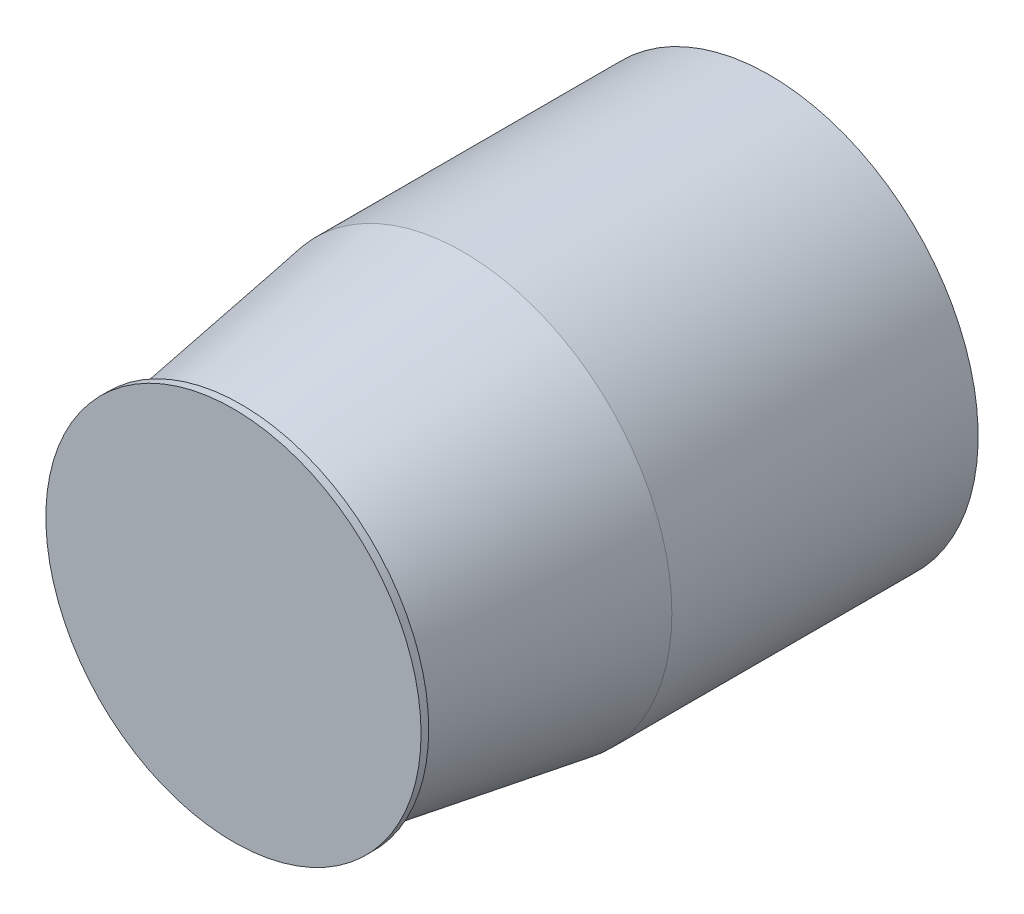
ISO-10303-21;
HEADER;
FILE_DESCRIPTION(('STEP AP214'),'2;1');
FILE_NAME('part.step','',(''),(''),'','','');
FILE_SCHEMA(('AUTOMOTIVE_DESIGN { 1 0 10303 214 1 1 1 1 }'));
ENDSEC;
DATA;
#1=APPLICATION_CONTEXT('core data for automotive mechanical design processes');
#2=APPLICATION_PROTOCOL_DEFINITION('international standard','automotive_design',2000,#1);
#3=PRODUCT_CONTEXT('',#1,'mechanical');
#4=PRODUCT('Part','Part','',(#3));
#5=PRODUCT_RELATED_PRODUCT_CATEGORY('part','',(#4));
#6=PRODUCT_DEFINITION_FORMATION('','',#4);
#7=PRODUCT_DEFINITION_CONTEXT('part definition',#1,'design');
#8=PRODUCT_DEFINITION('design','',#6,#7);
#9=PRODUCT_DEFINITION_SHAPE('','',#8);
#10=(LENGTH_UNIT() NAMED_UNIT(*) SI_UNIT(.MILLI.,.METRE.));
#11=(NAMED_UNIT(*) PLANE_ANGLE_UNIT() SI_UNIT($,.RADIAN.));
#12=(NAMED_UNIT(*) SI_UNIT($,.STERADIAN.) SOLID_ANGLE_UNIT());
#13=UNCERTAINTY_MEASURE_WITH_UNIT(LENGTH_MEASURE(1.E-05),#10,'distance_accuracy_value','');
#14=(GEOMETRIC_REPRESENTATION_CONTEXT(3) GLOBAL_UNCERTAINTY_ASSIGNED_CONTEXT((#13)) GLOBAL_UNIT_ASSIGNED_CONTEXT((#10,
#11,#12)) REPRESENTATION_CONTEXT('',''));
#15=CARTESIAN_POINT('',(0.,0.,0.));
#16=DIRECTION('',(0.,0.,1.));
#17=DIRECTION('',(1.,0.,0.));
#18=AXIS2_PLACEMENT_3D('',#15,#16,#17);
#19=CARTESIAN_POINT('',(0.,0.,0.));
#20=DIRECTION('',(0.,0.,-1.));
#21=DIRECTION('',(1.,0.,0.));
#22=AXIS2_PLACEMENT_3D('',#19,#20,#21);
#23=CONICAL_SURFACE('',#22,11.25,0.15707963267949);
#24=CARTESIAN_POINT('',(0.,0.,-15.));
#25=DIRECTION('',(0.,0.,-1.));
#26=DIRECTION('',(-1.,0.,0.));
#27=AXIS2_PLACEMENT_3D('',#24,#25,#26);
#28=CIRCLE('',#27,13.6257666048681);
#29=CARTESIAN_POINT('',(-13.6257666048681,0.,-15.));
#30=VERTEX_POINT('',#29);
#31=EDGE_CURVE('E56',#30,#30,#28,.T.);
#32=ORIENTED_EDGE('',*,*,#31,.F.);
#33=EDGE_LOOP('',(#32));
#34=FACE_BOUND('',#33,.T.);
#35=CARTESIAN_POINT('',(0.,0.,-0.5));
#36=DIRECTION('',(0.,0.,1.));
#37=DIRECTION('',(1.,0.,0.));
#38=AXIS2_PLACEMENT_3D('',#35,#36,#37);
#39=CIRCLE('',#38,11.3291922201623);
#40=CARTESIAN_POINT('',(11.3291922201623,0.,-0.5));
#41=VERTEX_POINT('',#40);
#42=EDGE_CURVE('E10',#41,#41,#39,.F.);
#43=ORIENTED_EDGE('',*,*,#42,.T.);
#44=EDGE_LOOP('',(#43));
#45=FACE_BOUND('',#44,.T.);
#46=ADVANCED_FACE('F39',(#34,#45),#23,.T.);
#47=CARTESIAN_POINT('',(0.,0.,-0.5));
#48=DIRECTION('',(0.,0.,1.));
#49=DIRECTION('',(1.,0.,0.));
#50=AXIS2_PLACEMENT_3D('',#47,#48,#49);
#51=CYLINDRICAL_SURFACE('',#50,12.25);
#52=CARTESIAN_POINT('',(0.,0.,-0.5));
#53=DIRECTION('',(0.,0.,1.));
#54=DIRECTION('',(1.,0.,0.));
#55=AXIS2_PLACEMENT_3D('',#52,#53,#54);
#56=CIRCLE('',#55,12.25);
#57=CARTESIAN_POINT('',(12.25,0.,-0.5));
#58=VERTEX_POINT('',#57);
#59=EDGE_CURVE('E45',#58,#58,#56,.T.);
#60=ORIENTED_EDGE('',*,*,#59,.T.);
#61=EDGE_LOOP('',(#60));
#62=FACE_BOUND('',#61,.T.);
#63=CARTESIAN_POINT('',(0.,0.,0.));
#64=DIRECTION('',(0.,0.,1.));
#65=DIRECTION('',(1.,0.,0.));
#66=AXIS2_PLACEMENT_3D('',#63,#64,#65);
#67=CIRCLE('',#66,12.25);
#68=CARTESIAN_POINT('',(12.25,0.,0.));
#69=VERTEX_POINT('',#68);
#70=EDGE_CURVE('E49',#69,#69,#67,.T.);
#71=ORIENTED_EDGE('',*,*,#70,.F.);
#72=EDGE_LOOP('',(#71));
#73=FACE_BOUND('',#72,.T.);
#74=ADVANCED_FACE('F72',(#62,#73),#51,.T.);
#75=CARTESIAN_POINT('',(0.,0.,-0.5));
#76=DIRECTION('',(0.,0.,1.));
#77=DIRECTION('',(1.,0.,0.));
#78=AXIS2_PLACEMENT_3D('',#75,#76,#77);
#79=PLANE('',#78);
#80=ORIENTED_EDGE('',*,*,#42,.F.);
#81=EDGE_LOOP('',(#80));
#82=FACE_BOUND('',#81,.T.);
#83=ORIENTED_EDGE('',*,*,#59,.F.);
#84=EDGE_LOOP('',(#83));
#85=FACE_BOUND('',#84,.T.);
#86=ADVANCED_FACE('F76',(#82,#85),#79,.F.);
#87=CARTESIAN_POINT('',(0.,0.,0.));
#88=DIRECTION('',(0.,0.,1.));
#89=DIRECTION('',(1.,0.,0.));
#90=AXIS2_PLACEMENT_3D('',#87,#88,#89);
#91=PLANE('',#90);
#92=ORIENTED_EDGE('',*,*,#70,.T.);
#93=EDGE_LOOP('',(#92));
#94=FACE_BOUND('',#93,.T.);
#95=ADVANCED_FACE('F67',(#94),#91,.T.);
#96=CARTESIAN_POINT('',(0.,0.,-35.));
#97=DIRECTION('',(0.,0.,1.));
#98=DIRECTION('',(1.,0.,0.));
#99=AXIS2_PLACEMENT_3D('',#96,#97,#98);
#100=CYLINDRICAL_SURFACE('',#99,13.6257666048681);
#101=CARTESIAN_POINT('',(0.,0.,-35.));
#102=DIRECTION('',(0.,0.,-1.));
#103=DIRECTION('',(-1.,0.,0.));
#104=AXIS2_PLACEMENT_3D('',#101,#102,#103);
#105=CIRCLE('',#104,13.6257666048681);
#106=CARTESIAN_POINT('',(-13.6257666048681,0.,-35.));
#107=VERTEX_POINT('',#106);
#108=EDGE_CURVE('E54',#107,#107,#105,.T.);
#109=ORIENTED_EDGE('',*,*,#108,.F.);
#110=EDGE_LOOP('',(#109));
#111=FACE_BOUND('',#110,.T.);
#112=ORIENTED_EDGE('',*,*,#31,.T.);
#113=EDGE_LOOP('',(#112));
#114=FACE_BOUND('',#113,.T.);
#115=ADVANCED_FACE('F64',(#111,#114),#100,.T.);
#116=CARTESIAN_POINT('',(0.,0.,-35.));
#117=DIRECTION('',(0.,0.,-1.));
#118=DIRECTION('',(-1.,0.,0.));
#119=AXIS2_PLACEMENT_3D('',#116,#117,#118);
#120=PLANE('',#119);
#121=ORIENTED_EDGE('',*,*,#108,.T.);
#122=EDGE_LOOP('',(#121));
#123=FACE_BOUND('',#122,.T.);
#124=ADVANCED_FACE('F62',(#123),#120,.T.);
#125=CLOSED_SHELL('',(#46,#74,#86,#95,#115,#124));
#126=MANIFOLD_SOLID_BREP('B2',#125);
#127=ADVANCED_BREP_SHAPE_REPRESENTATION('',(#18,#126),#14);
#128=SHAPE_DEFINITION_REPRESENTATION(#9,#127);
ENDSEC;
END-ISO-10303-21;
